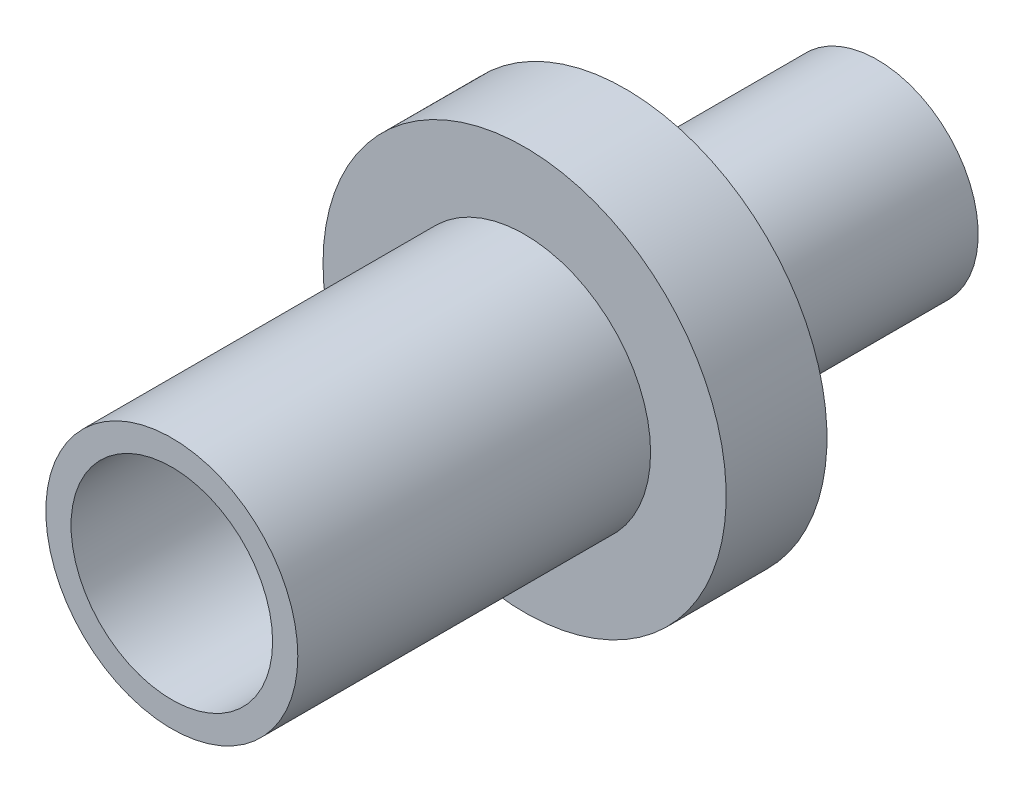
ISO-10303-21;
HEADER;
FILE_DESCRIPTION(('STEP AP214'),'2;1');
FILE_NAME('part.step','',(''),(''),'','','');
FILE_SCHEMA(('AUTOMOTIVE_DESIGN { 1 0 10303 214 1 1 1 1 }'));
ENDSEC;
DATA;
#1=APPLICATION_CONTEXT('core data for automotive mechanical design processes');
#2=APPLICATION_PROTOCOL_DEFINITION('international standard','automotive_design',2000,#1);
#3=PRODUCT_CONTEXT('',#1,'mechanical');
#4=PRODUCT('Part','Part','',(#3));
#5=PRODUCT_RELATED_PRODUCT_CATEGORY('part','',(#4));
#6=PRODUCT_DEFINITION_FORMATION('','',#4);
#7=PRODUCT_DEFINITION_CONTEXT('part definition',#1,'design');
#8=PRODUCT_DEFINITION('design','',#6,#7);
#9=PRODUCT_DEFINITION_SHAPE('','',#8);
#10=(LENGTH_UNIT() NAMED_UNIT(*) SI_UNIT(.MILLI.,.METRE.));
#11=(NAMED_UNIT(*) PLANE_ANGLE_UNIT() SI_UNIT($,.RADIAN.));
#12=(NAMED_UNIT(*) SI_UNIT($,.STERADIAN.) SOLID_ANGLE_UNIT());
#13=UNCERTAINTY_MEASURE_WITH_UNIT(LENGTH_MEASURE(1.E-05),#10,'distance_accuracy_value','');
#14=(GEOMETRIC_REPRESENTATION_CONTEXT(3) GLOBAL_UNCERTAINTY_ASSIGNED_CONTEXT((#13)) GLOBAL_UNIT_ASSIGNED_CONTEXT((#10,
#11,#12)) REPRESENTATION_CONTEXT('',''));
#15=CARTESIAN_POINT('',(0.,0.,0.));
#16=DIRECTION('',(0.,0.,1.));
#17=DIRECTION('',(1.,0.,0.));
#18=AXIS2_PLACEMENT_3D('',#15,#16,#17);
#19=CARTESIAN_POINT('',(-68.5858711935382,-90.,-3.));
#20=DIRECTION('',(0.,0.,1.));
#21=DIRECTION('',(1.,0.,0.));
#22=AXIS2_PLACEMENT_3D('',#19,#20,#21);
#23=CYLINDRICAL_SURFACE('',#22,2.5);
#24=CARTESIAN_POINT('',(-68.5858711935382,-90.,-3.));
#25=DIRECTION('',(0.,0.,1.));
#26=DIRECTION('',(1.,0.,0.));
#27=AXIS2_PLACEMENT_3D('',#24,#25,#26);
#28=CIRCLE('',#27,2.5);
#29=CARTESIAN_POINT('',(-66.0858711935382,-90.,-3.));
#30=VERTEX_POINT('',#29);
#31=EDGE_CURVE('E31',#30,#30,#28,.T.);
#32=ORIENTED_EDGE('',*,*,#31,.T.);
#33=EDGE_LOOP('',(#32));
#34=FACE_BOUND('',#33,.T.);
#35=CARTESIAN_POINT('',(-68.5858711935382,-90.,4.));
#36=DIRECTION('',(0.,0.,1.));
#37=DIRECTION('',(1.,0.,0.));
#38=AXIS2_PLACEMENT_3D('',#35,#36,#37);
#39=CIRCLE('',#38,2.5);
#40=CARTESIAN_POINT('',(-66.0858711935382,-90.,4.));
#41=VERTEX_POINT('',#40);
#42=EDGE_CURVE('E35',#41,#41,#39,.T.);
#43=ORIENTED_EDGE('',*,*,#42,.F.);
#44=EDGE_LOOP('',(#43));
#45=FACE_BOUND('',#44,.T.);
#46=ADVANCED_FACE('F28',(#34,#45),#23,.T.);
#47=CARTESIAN_POINT('',(-68.5858711935382,-90.,4.));
#48=DIRECTION('',(0.,0.,1.));
#49=DIRECTION('',(1.,0.,0.));
#50=AXIS2_PLACEMENT_3D('',#47,#48,#49);
#51=PLANE('',#50);
#52=CARTESIAN_POINT('',(-68.5858711935382,-90.,4.));
#53=DIRECTION('',(0.,0.,1.));
#54=DIRECTION('',(1.,0.,0.));
#55=AXIS2_PLACEMENT_3D('',#52,#53,#54);
#56=CIRCLE('',#55,2.);
#57=CARTESIAN_POINT('',(-66.5858711935382,-90.,4.));
#58=VERTEX_POINT('',#57);
#59=EDGE_CURVE('E47',#58,#58,#56,.T.);
#60=ORIENTED_EDGE('',*,*,#59,.F.);
#61=EDGE_LOOP('',(#60));
#62=FACE_BOUND('',#61,.T.);
#63=ORIENTED_EDGE('',*,*,#42,.T.);
#64=EDGE_LOOP('',(#63));
#65=FACE_BOUND('',#64,.T.);
#66=ADVANCED_FACE('F76',(#62,#65),#51,.T.);
#67=CARTESIAN_POINT('',(-68.5858711935382,-90.,-5.));
#68=DIRECTION('',(0.,0.,1.));
#69=DIRECTION('',(1.,0.,0.));
#70=AXIS2_PLACEMENT_3D('',#67,#68,#69);
#71=CYLINDRICAL_SURFACE('',#70,4.00000000000001);
#72=CARTESIAN_POINT('',(-68.5858711935382,-90.,-5.));
#73=DIRECTION('',(0.,0.,-1.));
#74=DIRECTION('',(-1.,0.,0.));
#75=AXIS2_PLACEMENT_3D('',#72,#73,#74);
#76=CIRCLE('',#75,4.00000000000001);
#77=CARTESIAN_POINT('',(-72.5858711935382,-90.,-5.));
#78=VERTEX_POINT('',#77);
#79=EDGE_CURVE('E50',#78,#78,#76,.T.);
#80=ORIENTED_EDGE('',*,*,#79,.F.);
#81=EDGE_LOOP('',(#80));
#82=FACE_BOUND('',#81,.T.);
#83=CARTESIAN_POINT('',(-68.5858711935382,-90.,-3.));
#84=DIRECTION('',(0.,0.,-1.));
#85=DIRECTION('',(-1.,0.,0.));
#86=AXIS2_PLACEMENT_3D('',#83,#84,#85);
#87=CIRCLE('',#86,4.00000000000001);
#88=CARTESIAN_POINT('',(-72.5858711935382,-90.,-3.));
#89=VERTEX_POINT('',#88);
#90=EDGE_CURVE('E46',#89,#89,#87,.T.);
#91=ORIENTED_EDGE('',*,*,#90,.T.);
#92=EDGE_LOOP('',(#91));
#93=FACE_BOUND('',#92,.T.);
#94=ADVANCED_FACE('F56',(#82,#93),#71,.T.);
#95=CARTESIAN_POINT('',(-68.5858711935382,-90.,-5.));
#96=DIRECTION('',(0.,0.,-1.));
#97=DIRECTION('',(-1.,0.,0.));
#98=AXIS2_PLACEMENT_3D('',#95,#96,#97);
#99=PLANE('',#98);
#100=CARTESIAN_POINT('',(-68.5858711935382,-90.,-5.));
#101=DIRECTION('',(0.,0.,-1.));
#102=DIRECTION('',(-1.,0.,0.));
#103=AXIS2_PLACEMENT_3D('',#100,#101,#102);
#104=CIRCLE('',#103,2.);
#105=CARTESIAN_POINT('',(-70.5858711935382,-90.,-5.));
#106=VERTEX_POINT('',#105);
#107=EDGE_CURVE('E10',#106,#106,#104,.T.);
#108=ORIENTED_EDGE('',*,*,#107,.F.);
#109=EDGE_LOOP('',(#108));
#110=FACE_BOUND('',#109,.T.);
#111=ORIENTED_EDGE('',*,*,#79,.T.);
#112=EDGE_LOOP('',(#111));
#113=FACE_BOUND('',#112,.T.);
#114=ADVANCED_FACE('F61',(#110,#113),#99,.T.);
#115=CARTESIAN_POINT('',(-68.5858711935382,-90.,-3.));
#116=DIRECTION('',(0.,0.,-1.));
#117=DIRECTION('',(-1.,0.,0.));
#118=AXIS2_PLACEMENT_3D('',#115,#116,#117);
#119=PLANE('',#118);
#120=ORIENTED_EDGE('',*,*,#31,.F.);
#121=EDGE_LOOP('',(#120));
#122=FACE_BOUND('',#121,.T.);
#123=ORIENTED_EDGE('',*,*,#90,.F.);
#124=EDGE_LOOP('',(#123));
#125=FACE_BOUND('',#124,.T.);
#126=ADVANCED_FACE('F58',(#122,#125),#119,.F.);
#127=CARTESIAN_POINT('',(-68.5858711935382,-90.,-1.));
#128=DIRECTION('',(0.,0.,1.));
#129=DIRECTION('',(1.,0.,0.));
#130=AXIS2_PLACEMENT_3D('',#127,#128,#129);
#131=CYLINDRICAL_SURFACE('',#130,2.);
#132=CARTESIAN_POINT('',(-68.5858711935382,-90.,-1.));
#133=DIRECTION('',(0.,0.,1.));
#134=DIRECTION('',(1.,0.,0.));
#135=AXIS2_PLACEMENT_3D('',#132,#133,#134);
#136=CIRCLE('',#135,2.);
#137=CARTESIAN_POINT('',(-66.5858711935382,-90.,-1.));
#138=VERTEX_POINT('',#137);
#139=EDGE_CURVE('E43',#138,#138,#136,.T.);
#140=ORIENTED_EDGE('',*,*,#139,.F.);
#141=EDGE_LOOP('',(#140));
#142=FACE_BOUND('',#141,.T.);
#143=ORIENTED_EDGE('',*,*,#59,.T.);
#144=EDGE_LOOP('',(#143));
#145=FACE_BOUND('',#144,.T.);
#146=ADVANCED_FACE('F60',(#142,#145),#131,.F.);
#147=CARTESIAN_POINT('',(-68.5858711935382,-90.,-1.));
#148=DIRECTION('',(0.,0.,1.));
#149=DIRECTION('',(1.,0.,0.));
#150=AXIS2_PLACEMENT_3D('',#147,#148,#149);
#151=PLANE('',#150);
#152=ORIENTED_EDGE('',*,*,#139,.T.);
#153=EDGE_LOOP('',(#152));
#154=FACE_BOUND('',#153,.T.);
#155=ADVANCED_FACE('F68',(#154),#151,.T.);
#156=CARTESIAN_POINT('',(-68.5858711935382,-90.,-10.));
#157=DIRECTION('',(0.,0.,1.));
#158=DIRECTION('',(1.,0.,0.));
#159=AXIS2_PLACEMENT_3D('',#156,#157,#158);
#160=CYLINDRICAL_SURFACE('',#159,2.);
#161=CARTESIAN_POINT('',(-68.5858711935382,-90.,-10.));
#162=DIRECTION('',(0.,0.,-1.));
#163=DIRECTION('',(-1.,0.,0.));
#164=AXIS2_PLACEMENT_3D('',#161,#162,#163);
#165=CIRCLE('',#164,2.);
#166=CARTESIAN_POINT('',(-70.5858711935382,-90.,-10.));
#167=VERTEX_POINT('',#166);
#168=EDGE_CURVE('E42',#167,#167,#165,.T.);
#169=ORIENTED_EDGE('',*,*,#168,.F.);
#170=EDGE_LOOP('',(#169));
#171=FACE_BOUND('',#170,.T.);
#172=ORIENTED_EDGE('',*,*,#107,.T.);
#173=EDGE_LOOP('',(#172));
#174=FACE_BOUND('',#173,.T.);
#175=ADVANCED_FACE('F111',(#171,#174),#160,.T.);
#176=CARTESIAN_POINT('',(-68.5858711935382,-90.,-10.));
#177=DIRECTION('',(0.,0.,-1.));
#178=DIRECTION('',(-1.,0.,0.));
#179=AXIS2_PLACEMENT_3D('',#176,#177,#178);
#180=PLANE('',#179);
#181=ORIENTED_EDGE('',*,*,#168,.T.);
#182=EDGE_LOOP('',(#181));
#183=FACE_BOUND('',#182,.T.);
#184=ADVANCED_FACE('F116',(#183),#180,.T.);
#185=CLOSED_SHELL('',(#46,#66,#94,#114,#126,#146,#155,#175,#184));
#186=MANIFOLD_SOLID_BREP('B2',#185);
#187=ADVANCED_BREP_SHAPE_REPRESENTATION('',(#18,#186),#14);
#188=SHAPE_DEFINITION_REPRESENTATION(#9,#187);
ENDSEC;
END-ISO-10303-21;
